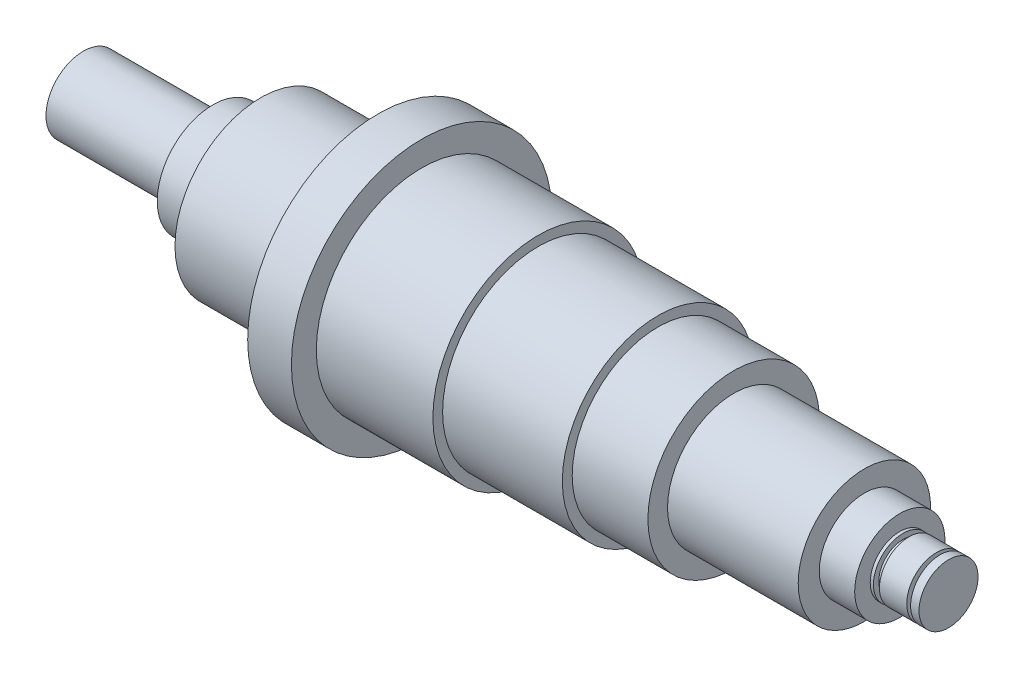
ISO-10303-21;
HEADER;
FILE_DESCRIPTION(('STEP AP214'),'2;1');
FILE_NAME('part.step','',(''),(''),'','','');
FILE_SCHEMA(('AUTOMOTIVE_DESIGN { 1 0 10303 214 1 1 1 1 }'));
ENDSEC;
DATA;
#1=APPLICATION_CONTEXT('core data for automotive mechanical design processes');
#2=APPLICATION_PROTOCOL_DEFINITION('international standard','automotive_design',2000,#1);
#3=PRODUCT_CONTEXT('',#1,'mechanical');
#4=PRODUCT('Part','Part','',(#3));
#5=PRODUCT_RELATED_PRODUCT_CATEGORY('part','',(#4));
#6=PRODUCT_DEFINITION_FORMATION('','',#4);
#7=PRODUCT_DEFINITION_CONTEXT('part definition',#1,'design');
#8=PRODUCT_DEFINITION('design','',#6,#7);
#9=PRODUCT_DEFINITION_SHAPE('','',#8);
#10=(LENGTH_UNIT() NAMED_UNIT(*) SI_UNIT(.MILLI.,.METRE.));
#11=(NAMED_UNIT(*) PLANE_ANGLE_UNIT() SI_UNIT($,.RADIAN.));
#12=(NAMED_UNIT(*) SI_UNIT($,.STERADIAN.) SOLID_ANGLE_UNIT());
#13=UNCERTAINTY_MEASURE_WITH_UNIT(LENGTH_MEASURE(1.E-05),#10,'distance_accuracy_value','');
#14=(GEOMETRIC_REPRESENTATION_CONTEXT(3) GLOBAL_UNCERTAINTY_ASSIGNED_CONTEXT((#13)) GLOBAL_UNIT_ASSIGNED_CONTEXT((#10,
#11,#12)) REPRESENTATION_CONTEXT('',''));
#15=CARTESIAN_POINT('',(0.,0.,0.));
#16=DIRECTION('',(0.,0.,1.));
#17=DIRECTION('',(1.,0.,0.));
#18=AXIS2_PLACEMENT_3D('',#15,#16,#17);
#19=CARTESIAN_POINT('',(-732.666569538298,0.,0.));
#20=DIRECTION('',(-1.,0.,0.));
#21=DIRECTION('',(0.,0.,1.));
#22=AXIS2_PLACEMENT_3D('',#19,#20,#21);
#23=CYLINDRICAL_SURFACE('',#22,31.5923948312581);
#24=CARTESIAN_POINT('',(-732.666569538298,0.,0.));
#25=DIRECTION('',(-1.,0.,0.));
#26=DIRECTION('',(0.,0.,1.));
#27=AXIS2_PLACEMENT_3D('',#24,#25,#26);
#28=CIRCLE('',#27,31.5923948312581);
#29=CARTESIAN_POINT('',(-732.666569538298,0.,31.5923948312581));
#30=VERTEX_POINT('',#29);
#31=EDGE_CURVE('E10',#30,#30,#28,.T.);
#32=ORIENTED_EDGE('',*,*,#31,.F.);
#33=EDGE_LOOP('',(#32));
#34=FACE_BOUND('',#33,.T.);
#35=CARTESIAN_POINT('',(-622.932317141486,0.,0.));
#36=DIRECTION('',(-1.,0.,0.));
#37=DIRECTION('',(0.,0.,1.));
#38=AXIS2_PLACEMENT_3D('',#35,#36,#37);
#39=CIRCLE('',#38,31.5923948312581);
#40=CARTESIAN_POINT('',(-622.932317141486,0.,31.5923948312581));
#41=VERTEX_POINT('',#40);
#42=EDGE_CURVE('E125',#41,#41,#39,.T.);
#43=ORIENTED_EDGE('',*,*,#42,.T.);
#44=EDGE_LOOP('',(#43));
#45=FACE_BOUND('',#44,.T.);
#46=ADVANCED_FACE('F37',(#34,#45),#23,.T.);
#47=CARTESIAN_POINT('',(-732.666569538298,0.,0.));
#48=DIRECTION('',(1.,0.,0.));
#49=DIRECTION('',(0.,0.,-1.));
#50=AXIS2_PLACEMENT_3D('',#47,#48,#49);
#51=PLANE('',#50);
#52=ORIENTED_EDGE('',*,*,#31,.T.);
#53=EDGE_LOOP('',(#52));
#54=FACE_BOUND('',#53,.T.);
#55=ADVANCED_FACE('F287',(#54),#51,.F.);
#56=CARTESIAN_POINT('',(0.,0.,0.));
#57=DIRECTION('',(-1.,0.,0.));
#58=DIRECTION('',(0.,0.,1.));
#59=AXIS2_PLACEMENT_3D('',#56,#57,#58);
#60=PLANE('',#59);
#61=CARTESIAN_POINT('',(0.,0.,0.));
#62=DIRECTION('',(-1.,0.,0.));
#63=DIRECTION('',(0.,0.,1.));
#64=AXIS2_PLACEMENT_3D('',#61,#62,#63);
#65=CIRCLE('',#64,25.);
#66=CARTESIAN_POINT('',(0.,0.,25.));
#67=VERTEX_POINT('',#66);
#68=EDGE_CURVE('E43',#67,#67,#65,.T.);
#69=ORIENTED_EDGE('',*,*,#68,.F.);
#70=EDGE_LOOP('',(#69));
#71=FACE_BOUND('',#70,.T.);
#72=ADVANCED_FACE('F282',(#71),#60,.F.);
#73=CARTESIAN_POINT('',(-732.666569538298,0.,0.));
#74=DIRECTION('',(-1.,0.,0.));
#75=DIRECTION('',(0.,0.,1.));
#76=AXIS2_PLACEMENT_3D('',#73,#74,#75);
#77=CYLINDRICAL_SURFACE('',#76,25.);
#78=CARTESIAN_POINT('',(-7.14828871386097,0.,0.));
#79=DIRECTION('',(-1.,0.,0.));
#80=DIRECTION('',(0.,0.,1.));
#81=AXIS2_PLACEMENT_3D('',#78,#79,#80);
#82=CIRCLE('',#81,25.);
#83=CARTESIAN_POINT('',(-7.14828871386097,0.,25.));
#84=VERTEX_POINT('',#83);
#85=EDGE_CURVE('E47',#84,#84,#82,.T.);
#86=ORIENTED_EDGE('',*,*,#85,.F.);
#87=EDGE_LOOP('',(#86));
#88=FACE_BOUND('',#87,.T.);
#89=ORIENTED_EDGE('',*,*,#68,.T.);
#90=EDGE_LOOP('',(#89));
#91=FACE_BOUND('',#90,.T.);
#92=ADVANCED_FACE('F277',(#88,#91),#77,.T.);
#93=CARTESIAN_POINT('',(-7.14828871386097,0.,0.));
#94=DIRECTION('',(1.,0.,0.));
#95=DIRECTION('',(0.,0.,-1.));
#96=AXIS2_PLACEMENT_3D('',#93,#94,#95);
#97=PLANE('',#96);
#98=CARTESIAN_POINT('',(-7.14828871386097,0.,0.));
#99=DIRECTION('',(-1.,0.,0.));
#100=DIRECTION('',(0.,0.,1.));
#101=AXIS2_PLACEMENT_3D('',#98,#99,#100);
#102=CIRCLE('',#101,20.4717400380726);
#103=CARTESIAN_POINT('',(-7.14828871386097,0.,20.4717400380726));
#104=VERTEX_POINT('',#103);
#105=EDGE_CURVE('E51',#104,#104,#102,.T.);
#106=ORIENTED_EDGE('',*,*,#105,.F.);
#107=EDGE_LOOP('',(#106));
#108=FACE_BOUND('',#107,.T.);
#109=ORIENTED_EDGE('',*,*,#85,.T.);
#110=EDGE_LOOP('',(#109));
#111=FACE_BOUND('',#110,.T.);
#112=ADVANCED_FACE('F271',(#108,#111),#97,.F.);
#113=CARTESIAN_POINT('',(-732.666569538298,0.,0.));
#114=DIRECTION('',(-1.,0.,0.));
#115=DIRECTION('',(0.,0.,1.));
#116=AXIS2_PLACEMENT_3D('',#113,#114,#115);
#117=CYLINDRICAL_SURFACE('',#116,20.4717400380726);
#118=CARTESIAN_POINT('',(-10.3849690302732,0.,0.));
#119=DIRECTION('',(-1.,0.,0.));
#120=DIRECTION('',(0.,0.,1.));
#121=AXIS2_PLACEMENT_3D('',#118,#119,#120);
#122=CIRCLE('',#121,20.4717400380726);
#123=CARTESIAN_POINT('',(-10.3849690302732,0.,20.4717400380726));
#124=VERTEX_POINT('',#123);
#125=EDGE_CURVE('E56',#124,#124,#122,.T.);
#126=ORIENTED_EDGE('',*,*,#125,.F.);
#127=EDGE_LOOP('',(#126));
#128=FACE_BOUND('',#127,.T.);
#129=ORIENTED_EDGE('',*,*,#105,.T.);
#130=EDGE_LOOP('',(#129));
#131=FACE_BOUND('',#130,.T.);
#132=ADVANCED_FACE('F265',(#128,#131),#117,.T.);
#133=CARTESIAN_POINT('',(-10.3849690302732,0.,0.));
#134=DIRECTION('',(-1.,0.,0.));
#135=DIRECTION('',(0.,0.,1.));
#136=AXIS2_PLACEMENT_3D('',#133,#134,#135);
#137=PLANE('',#136);
#138=CARTESIAN_POINT('',(-10.3849690302732,0.,0.));
#139=DIRECTION('',(-1.,0.,0.));
#140=DIRECTION('',(0.,0.,1.));
#141=AXIS2_PLACEMENT_3D('',#138,#139,#140);
#142=CIRCLE('',#141,25.);
#143=CARTESIAN_POINT('',(-10.3849690302732,0.,25.));
#144=VERTEX_POINT('',#143);
#145=EDGE_CURVE('E59',#144,#144,#142,.T.);
#146=ORIENTED_EDGE('',*,*,#145,.F.);
#147=EDGE_LOOP('',(#146));
#148=FACE_BOUND('',#147,.T.);
#149=ORIENTED_EDGE('',*,*,#125,.T.);
#150=EDGE_LOOP('',(#149));
#151=FACE_BOUND('',#150,.T.);
#152=ADVANCED_FACE('F259',(#148,#151),#137,.F.);
#153=CARTESIAN_POINT('',(-732.666569538298,0.,0.));
#154=DIRECTION('',(-1.,0.,0.));
#155=DIRECTION('',(0.,0.,1.));
#156=AXIS2_PLACEMENT_3D('',#153,#154,#155);
#157=CYLINDRICAL_SURFACE('',#156,25.);
#158=CARTESIAN_POINT('',(-33.5041141475036,0.,0.));
#159=DIRECTION('',(-1.,0.,0.));
#160=DIRECTION('',(0.,0.,1.));
#161=AXIS2_PLACEMENT_3D('',#158,#159,#160);
#162=CIRCLE('',#161,25.);
#163=CARTESIAN_POINT('',(-33.5041141475036,0.,25.));
#164=VERTEX_POINT('',#163);
#165=EDGE_CURVE('E62',#164,#164,#162,.T.);
#166=ORIENTED_EDGE('',*,*,#165,.F.);
#167=EDGE_LOOP('',(#166));
#168=FACE_BOUND('',#167,.T.);
#169=ORIENTED_EDGE('',*,*,#145,.T.);
#170=EDGE_LOOP('',(#169));
#171=FACE_BOUND('',#170,.T.);
#172=ADVANCED_FACE('F253',(#168,#171),#157,.T.);
#173=CARTESIAN_POINT('',(-33.5041141475036,0.,0.));
#174=DIRECTION('',(1.,0.,0.));
#175=DIRECTION('',(0.,0.,-1.));
#176=AXIS2_PLACEMENT_3D('',#173,#174,#175);
#177=PLANE('',#176);
#178=CARTESIAN_POINT('',(-33.5041141475036,0.,0.));
#179=DIRECTION('',(-1.,0.,0.));
#180=DIRECTION('',(0.,0.,1.));
#181=AXIS2_PLACEMENT_3D('',#178,#179,#180);
#182=CIRCLE('',#181,20.4717400380726);
#183=CARTESIAN_POINT('',(-33.5041141475036,0.,20.4717400380726));
#184=VERTEX_POINT('',#183);
#185=EDGE_CURVE('E65',#184,#184,#182,.T.);
#186=ORIENTED_EDGE('',*,*,#185,.F.);
#187=EDGE_LOOP('',(#186));
#188=FACE_BOUND('',#187,.T.);
#189=ORIENTED_EDGE('',*,*,#165,.T.);
#190=EDGE_LOOP('',(#189));
#191=FACE_BOUND('',#190,.T.);
#192=ADVANCED_FACE('F247',(#188,#191),#177,.F.);
#193=CARTESIAN_POINT('',(-732.666569538298,0.,0.));
#194=DIRECTION('',(-1.,0.,0.));
#195=DIRECTION('',(0.,0.,1.));
#196=AXIS2_PLACEMENT_3D('',#193,#194,#195);
#197=CYLINDRICAL_SURFACE('',#196,20.4717400380726);
#198=CARTESIAN_POINT('',(-38.5903260732944,0.,0.));
#199=DIRECTION('',(-1.,0.,0.));
#200=DIRECTION('',(0.,0.,1.));
#201=AXIS2_PLACEMENT_3D('',#198,#199,#200);
#202=CIRCLE('',#201,20.4717400380726);
#203=CARTESIAN_POINT('',(-38.5903260732944,0.,20.4717400380726));
#204=VERTEX_POINT('',#203);
#205=EDGE_CURVE('E68',#204,#204,#202,.T.);
#206=ORIENTED_EDGE('',*,*,#205,.F.);
#207=EDGE_LOOP('',(#206));
#208=FACE_BOUND('',#207,.T.);
#209=ORIENTED_EDGE('',*,*,#185,.T.);
#210=EDGE_LOOP('',(#209));
#211=FACE_BOUND('',#210,.T.);
#212=ADVANCED_FACE('F241',(#208,#211),#197,.T.);
#213=CARTESIAN_POINT('',(-38.5903260732944,-4.13938083091105E-13,0.));
#214=DIRECTION('',(-1.,0.,0.));
#215=DIRECTION('',(0.,0.,1.));
#216=AXIS2_PLACEMENT_3D('',#213,#214,#215);
#217=PLANE('',#216);
#218=CARTESIAN_POINT('',(-38.5903260732944,0.,0.));
#219=DIRECTION('',(-1.,0.,0.));
#220=DIRECTION('',(0.,0.,1.));
#221=AXIS2_PLACEMENT_3D('',#218,#219,#220);
#222=CIRCLE('',#221,25.);
#223=CARTESIAN_POINT('',(-38.5903260732944,0.,25.));
#224=VERTEX_POINT('',#223);
#225=EDGE_CURVE('E71',#224,#224,#222,.T.);
#226=ORIENTED_EDGE('',*,*,#225,.F.);
#227=EDGE_LOOP('',(#226));
#228=FACE_BOUND('',#227,.T.);
#229=ORIENTED_EDGE('',*,*,#205,.T.);
#230=EDGE_LOOP('',(#229));
#231=FACE_BOUND('',#230,.T.);
#232=ADVANCED_FACE('F235',(#228,#231),#217,.F.);
#233=CARTESIAN_POINT('',(-732.666569538298,0.,0.));
#234=DIRECTION('',(-1.,0.,0.));
#235=DIRECTION('',(0.,0.,1.));
#236=AXIS2_PLACEMENT_3D('',#233,#234,#235);
#237=CYLINDRICAL_SURFACE('',#236,25.);
#238=CARTESIAN_POINT('',(-41.3110403099847,0.,0.));
#239=DIRECTION('',(-1.,0.,0.));
#240=DIRECTION('',(0.,0.,1.));
#241=AXIS2_PLACEMENT_3D('',#238,#239,#240);
#242=CIRCLE('',#241,25.);
#243=CARTESIAN_POINT('',(-41.3110403099847,0.,25.));
#244=VERTEX_POINT('',#243);
#245=EDGE_CURVE('E74',#244,#244,#242,.T.);
#246=ORIENTED_EDGE('',*,*,#245,.F.);
#247=EDGE_LOOP('',(#246));
#248=FACE_BOUND('',#247,.T.);
#249=ORIENTED_EDGE('',*,*,#225,.T.);
#250=EDGE_LOOP('',(#249));
#251=FACE_BOUND('',#250,.T.);
#252=ADVANCED_FACE('F229',(#248,#251),#237,.T.);
#253=CARTESIAN_POINT('',(-41.3110403099847,0.,0.));
#254=DIRECTION('',(-1.,0.,0.));
#255=DIRECTION('',(0.,0.,1.));
#256=AXIS2_PLACEMENT_3D('',#253,#254,#255);
#257=PLANE('',#256);
#258=CARTESIAN_POINT('',(-41.3110403099847,0.,0.));
#259=DIRECTION('',(-1.,0.,0.));
#260=DIRECTION('',(0.,0.,1.));
#261=AXIS2_PLACEMENT_3D('',#258,#259,#260);
#262=CIRCLE('',#261,38.1847896625163);
#263=CARTESIAN_POINT('',(-41.3110403099847,0.,38.1847896625163));
#264=VERTEX_POINT('',#263);
#265=EDGE_CURVE('E77',#264,#264,#262,.T.);
#266=ORIENTED_EDGE('',*,*,#265,.F.);
#267=EDGE_LOOP('',(#266));
#268=FACE_BOUND('',#267,.T.);
#269=ORIENTED_EDGE('',*,*,#245,.T.);
#270=EDGE_LOOP('',(#269));
#271=FACE_BOUND('',#270,.T.);
#272=ADVANCED_FACE('F223',(#268,#271),#257,.F.);
#273=CARTESIAN_POINT('',(-732.666569538298,0.,0.));
#274=DIRECTION('',(-1.,0.,0.));
#275=DIRECTION('',(0.,0.,1.));
#276=AXIS2_PLACEMENT_3D('',#273,#274,#275);
#277=CYLINDRICAL_SURFACE('',#276,38.1847896625163);
#278=CARTESIAN_POINT('',(-71.2650353921759,0.,0.));
#279=DIRECTION('',(-1.,0.,0.));
#280=DIRECTION('',(0.,0.,1.));
#281=AXIS2_PLACEMENT_3D('',#278,#279,#280);
#282=CIRCLE('',#281,38.1847896625163);
#283=CARTESIAN_POINT('',(-71.2650353921759,0.,38.1847896625163));
#284=VERTEX_POINT('',#283);
#285=EDGE_CURVE('E80',#284,#284,#282,.T.);
#286=ORIENTED_EDGE('',*,*,#285,.F.);
#287=EDGE_LOOP('',(#286));
#288=FACE_BOUND('',#287,.T.);
#289=ORIENTED_EDGE('',*,*,#265,.T.);
#290=EDGE_LOOP('',(#289));
#291=FACE_BOUND('',#290,.T.);
#292=ADVANCED_FACE('F217',(#288,#291),#277,.T.);
#293=CARTESIAN_POINT('',(-71.2650353921759,0.,0.));
#294=DIRECTION('',(-1.,0.,0.));
#295=DIRECTION('',(0.,0.,1.));
#296=AXIS2_PLACEMENT_3D('',#293,#294,#295);
#297=PLANE('',#296);
#298=CARTESIAN_POINT('',(-71.2650353921759,0.,0.));
#299=DIRECTION('',(-1.,0.,0.));
#300=DIRECTION('',(0.,0.,1.));
#301=AXIS2_PLACEMENT_3D('',#298,#299,#300);
#302=CIRCLE('',#301,56.0242356320245);
#303=CARTESIAN_POINT('',(-71.2650353921759,0.,56.0242356320245));
#304=VERTEX_POINT('',#303);
#305=EDGE_CURVE('E83',#304,#304,#302,.T.);
#306=ORIENTED_EDGE('',*,*,#305,.F.);
#307=EDGE_LOOP('',(#306));
#308=FACE_BOUND('',#307,.T.);
#309=ORIENTED_EDGE('',*,*,#285,.T.);
#310=EDGE_LOOP('',(#309));
#311=FACE_BOUND('',#310,.T.);
#312=ADVANCED_FACE('F211',(#308,#311),#297,.F.);
#313=CARTESIAN_POINT('',(-732.666569538298,0.,0.));
#314=DIRECTION('',(-1.,0.,0.));
#315=DIRECTION('',(0.,0.,1.));
#316=AXIS2_PLACEMENT_3D('',#313,#314,#315);
#317=CYLINDRICAL_SURFACE('',#316,56.0242356320245);
#318=CARTESIAN_POINT('',(-181.930073101329,0.,0.));
#319=DIRECTION('',(-1.,0.,0.));
#320=DIRECTION('',(0.,0.,1.));
#321=AXIS2_PLACEMENT_3D('',#318,#319,#320);
#322=CIRCLE('',#321,56.0242356320245);
#323=CARTESIAN_POINT('',(-181.930073101329,0.,56.0242356320245));
#324=VERTEX_POINT('',#323);
#325=EDGE_CURVE('E86',#324,#324,#322,.T.);
#326=ORIENTED_EDGE('',*,*,#325,.F.);
#327=EDGE_LOOP('',(#326));
#328=FACE_BOUND('',#327,.T.);
#329=ORIENTED_EDGE('',*,*,#305,.T.);
#330=EDGE_LOOP('',(#329));
#331=FACE_BOUND('',#330,.T.);
#332=ADVANCED_FACE('F205',(#328,#331),#317,.T.);
#333=CARTESIAN_POINT('',(-181.930073101329,0.,0.));
#334=DIRECTION('',(-1.,0.,0.));
#335=DIRECTION('',(0.,0.,1.));
#336=AXIS2_PLACEMENT_3D('',#333,#334,#335);
#337=PLANE('',#336);
#338=CARTESIAN_POINT('',(-181.930073101329,0.,0.));
#339=DIRECTION('',(-1.,0.,0.));
#340=DIRECTION('',(0.,0.,1.));
#341=AXIS2_PLACEMENT_3D('',#338,#339,#340);
#342=CIRCLE('',#341,72.6542276374983);
#343=CARTESIAN_POINT('',(-181.930073101329,0.,72.6542276374983));
#344=VERTEX_POINT('',#343);
#345=EDGE_CURVE('E89',#344,#344,#342,.T.);
#346=ORIENTED_EDGE('',*,*,#345,.F.);
#347=EDGE_LOOP('',(#346));
#348=FACE_BOUND('',#347,.T.);
#349=ORIENTED_EDGE('',*,*,#325,.T.);
#350=EDGE_LOOP('',(#349));
#351=FACE_BOUND('',#350,.T.);
#352=ADVANCED_FACE('F199',(#348,#351),#337,.F.);
#353=CARTESIAN_POINT('',(-732.666569538298,0.,0.));
#354=DIRECTION('',(-1.,0.,0.));
#355=DIRECTION('',(0.,0.,1.));
#356=AXIS2_PLACEMENT_3D('',#353,#354,#355);
#357=CYLINDRICAL_SURFACE('',#356,72.6542276374983);
#358=CARTESIAN_POINT('',(-246.031133195155,0.,0.));
#359=DIRECTION('',(-1.,0.,0.));
#360=DIRECTION('',(0.,0.,1.));
#361=AXIS2_PLACEMENT_3D('',#358,#359,#360);
#362=CIRCLE('',#361,72.6542276374983);
#363=CARTESIAN_POINT('',(-246.031133195155,0.,72.6542276374983));
#364=VERTEX_POINT('',#363);
#365=EDGE_CURVE('E92',#364,#364,#362,.T.);
#366=ORIENTED_EDGE('',*,*,#365,.F.);
#367=EDGE_LOOP('',(#366));
#368=FACE_BOUND('',#367,.T.);
#369=ORIENTED_EDGE('',*,*,#345,.T.);
#370=EDGE_LOOP('',(#369));
#371=FACE_BOUND('',#370,.T.);
#372=ADVANCED_FACE('F193',(#368,#371),#357,.T.);
#373=CARTESIAN_POINT('',(-246.031133195155,0.,0.));
#374=DIRECTION('',(-1.,0.,0.));
#375=DIRECTION('',(0.,0.,1.));
#376=AXIS2_PLACEMENT_3D('',#373,#374,#375);
#377=PLANE('',#376);
#378=CARTESIAN_POINT('',(-246.031133195155,0.,0.));
#379=DIRECTION('',(-1.,0.,0.));
#380=DIRECTION('',(0.,0.,1.));
#381=AXIS2_PLACEMENT_3D('',#378,#379,#380);
#382=CIRCLE('',#381,81.0107310972691);
#383=CARTESIAN_POINT('',(-246.031133195155,0.,81.0107310972691));
#384=VERTEX_POINT('',#383);
#385=EDGE_CURVE('E95',#384,#384,#382,.T.);
#386=ORIENTED_EDGE('',*,*,#385,.F.);
#387=EDGE_LOOP('',(#386));
#388=FACE_BOUND('',#387,.T.);
#389=ORIENTED_EDGE('',*,*,#365,.T.);
#390=EDGE_LOOP('',(#389));
#391=FACE_BOUND('',#390,.T.);
#392=ADVANCED_FACE('F187',(#388,#391),#377,.F.);
#393=CARTESIAN_POINT('',(-732.666569538298,0.,0.));
#394=DIRECTION('',(-1.,0.,0.));
#395=DIRECTION('',(0.,0.,1.));
#396=AXIS2_PLACEMENT_3D('',#393,#394,#395);
#397=CYLINDRICAL_SURFACE('',#396,81.0107310972691);
#398=CARTESIAN_POINT('',(-347.417415209531,0.,0.));
#399=DIRECTION('',(-1.,0.,0.));
#400=DIRECTION('',(0.,0.,1.));
#401=AXIS2_PLACEMENT_3D('',#398,#399,#400);
#402=CIRCLE('',#401,81.0107310972691);
#403=CARTESIAN_POINT('',(-347.417415209531,0.,81.0107310972691));
#404=VERTEX_POINT('',#403);
#405=EDGE_CURVE('E98',#404,#404,#402,.T.);
#406=ORIENTED_EDGE('',*,*,#405,.F.);
#407=EDGE_LOOP('',(#406));
#408=FACE_BOUND('',#407,.T.);
#409=ORIENTED_EDGE('',*,*,#385,.T.);
#410=EDGE_LOOP('',(#409));
#411=FACE_BOUND('',#410,.T.);
#412=ADVANCED_FACE('F181',(#408,#411),#397,.T.);
#413=CARTESIAN_POINT('',(-347.417415209531,0.,0.));
#414=DIRECTION('',(-1.,0.,0.));
#415=DIRECTION('',(0.,0.,1.));
#416=AXIS2_PLACEMENT_3D('',#413,#414,#415);
#417=PLANE('',#416);
#418=CARTESIAN_POINT('',(-347.417415209531,0.,0.));
#419=DIRECTION('',(-1.,0.,0.));
#420=DIRECTION('',(0.,0.,1.));
#421=AXIS2_PLACEMENT_3D('',#418,#419,#420);
#422=CIRCLE('',#421,89.2375213615267);
#423=CARTESIAN_POINT('',(-347.417415209531,0.,89.2375213615267));
#424=VERTEX_POINT('',#423);
#425=EDGE_CURVE('E101',#424,#424,#422,.T.);
#426=ORIENTED_EDGE('',*,*,#425,.F.);
#427=EDGE_LOOP('',(#426));
#428=FACE_BOUND('',#427,.T.);
#429=ORIENTED_EDGE('',*,*,#405,.T.);
#430=EDGE_LOOP('',(#429));
#431=FACE_BOUND('',#430,.T.);
#432=ADVANCED_FACE('F175',(#428,#431),#417,.F.);
#433=CARTESIAN_POINT('',(-732.666569538298,0.,0.));
#434=DIRECTION('',(-1.,0.,0.));
#435=DIRECTION('',(0.,0.,1.));
#436=AXIS2_PLACEMENT_3D('',#433,#434,#435);
#437=CYLINDRICAL_SURFACE('',#436,89.2375213615267);
#438=CARTESIAN_POINT('',(-446.138898380622,0.,0.));
#439=DIRECTION('',(-1.,0.,0.));
#440=DIRECTION('',(0.,0.,1.));
#441=AXIS2_PLACEMENT_3D('',#438,#439,#440);
#442=CIRCLE('',#441,89.2375213615267);
#443=CARTESIAN_POINT('',(-446.138898380622,0.,89.2375213615267));
#444=VERTEX_POINT('',#443);
#445=EDGE_CURVE('E104',#444,#444,#442,.T.);
#446=ORIENTED_EDGE('',*,*,#445,.F.);
#447=EDGE_LOOP('',(#446));
#448=FACE_BOUND('',#447,.T.);
#449=ORIENTED_EDGE('',*,*,#425,.T.);
#450=EDGE_LOOP('',(#449));
#451=FACE_BOUND('',#450,.T.);
#452=ADVANCED_FACE('F169',(#448,#451),#437,.T.);
#453=CARTESIAN_POINT('',(-446.138898380622,0.,0.));
#454=DIRECTION('',(-1.,0.,0.));
#455=DIRECTION('',(0.,0.,1.));
#456=AXIS2_PLACEMENT_3D('',#453,#454,#455);
#457=PLANE('',#456);
#458=CARTESIAN_POINT('',(-446.138898380622,0.,0.));
#459=DIRECTION('',(-1.,0.,0.));
#460=DIRECTION('',(0.,0.,1.));
#461=AXIS2_PLACEMENT_3D('',#458,#459,#460);
#462=CIRCLE('',#461,110.318671413687);
#463=CARTESIAN_POINT('',(-446.138898380622,0.,110.318671413687));
#464=VERTEX_POINT('',#463);
#465=EDGE_CURVE('E107',#464,#464,#462,.T.);
#466=ORIENTED_EDGE('',*,*,#465,.F.);
#467=EDGE_LOOP('',(#466));
#468=FACE_BOUND('',#467,.T.);
#469=ORIENTED_EDGE('',*,*,#445,.T.);
#470=EDGE_LOOP('',(#469));
#471=FACE_BOUND('',#470,.T.);
#472=ADVANCED_FACE('F163',(#468,#471),#457,.F.);
#473=CARTESIAN_POINT('',(-732.666569538298,0.,0.));
#474=DIRECTION('',(-1.,0.,0.));
#475=DIRECTION('',(0.,0.,1.));
#476=AXIS2_PLACEMENT_3D('',#473,#474,#475);
#477=CYLINDRICAL_SURFACE('',#476,110.318671413687);
#478=CARTESIAN_POINT('',(-483.159454569781,0.,0.));
#479=DIRECTION('',(-1.,0.,0.));
#480=DIRECTION('',(0.,0.,1.));
#481=AXIS2_PLACEMENT_3D('',#478,#479,#480);
#482=CIRCLE('',#481,110.318671413687);
#483=CARTESIAN_POINT('',(-483.159454569781,0.,110.318671413687));
#484=VERTEX_POINT('',#483);
#485=EDGE_CURVE('E110',#484,#484,#482,.T.);
#486=ORIENTED_EDGE('',*,*,#485,.F.);
#487=EDGE_LOOP('',(#486));
#488=FACE_BOUND('',#487,.T.);
#489=ORIENTED_EDGE('',*,*,#465,.T.);
#490=EDGE_LOOP('',(#489));
#491=FACE_BOUND('',#490,.T.);
#492=ADVANCED_FACE('F157',(#488,#491),#477,.T.);
#493=CARTESIAN_POINT('',(-483.159454569781,0.,0.));
#494=DIRECTION('',(1.,0.,0.));
#495=DIRECTION('',(0.,0.,-1.));
#496=AXIS2_PLACEMENT_3D('',#493,#494,#495);
#497=PLANE('',#496);
#498=CARTESIAN_POINT('',(-483.159454569781,0.,0.));
#499=DIRECTION('',(-1.,0.,0.));
#500=DIRECTION('',(0.,0.,1.));
#501=AXIS2_PLACEMENT_3D('',#498,#499,#500);
#502=CIRCLE('',#501,72.6542276374983);
#503=CARTESIAN_POINT('',(-483.159454569781,0.,72.6542276374983));
#504=VERTEX_POINT('',#503);
#505=EDGE_CURVE('E113',#504,#504,#502,.T.);
#506=ORIENTED_EDGE('',*,*,#505,.F.);
#507=EDGE_LOOP('',(#506));
#508=FACE_BOUND('',#507,.T.);
#509=ORIENTED_EDGE('',*,*,#485,.T.);
#510=EDGE_LOOP('',(#509));
#511=FACE_BOUND('',#510,.T.);
#512=ADVANCED_FACE('F151',(#508,#511),#497,.F.);
#513=CARTESIAN_POINT('',(-732.666569538298,0.,0.));
#514=DIRECTION('',(-1.,0.,0.));
#515=DIRECTION('',(0.,0.,1.));
#516=AXIS2_PLACEMENT_3D('',#513,#514,#515);
#517=CYLINDRICAL_SURFACE('',#516,72.6542276374983);
#518=CARTESIAN_POINT('',(-582.395112132388,0.,0.));
#519=DIRECTION('',(-1.,0.,0.));
#520=DIRECTION('',(0.,0.,1.));
#521=AXIS2_PLACEMENT_3D('',#518,#519,#520);
#522=CIRCLE('',#521,72.6542276374983);
#523=CARTESIAN_POINT('',(-582.395112132388,0.,72.6542276374983));
#524=VERTEX_POINT('',#523);
#525=EDGE_CURVE('E116',#524,#524,#522,.T.);
#526=ORIENTED_EDGE('',*,*,#525,.F.);
#527=EDGE_LOOP('',(#526));
#528=FACE_BOUND('',#527,.T.);
#529=ORIENTED_EDGE('',*,*,#505,.T.);
#530=EDGE_LOOP('',(#529));
#531=FACE_BOUND('',#530,.T.);
#532=ADVANCED_FACE('F145',(#528,#531),#517,.T.);
#533=CARTESIAN_POINT('',(-582.395112132388,0.,0.));
#534=DIRECTION('',(1.,0.,0.));
#535=DIRECTION('',(0.,0.,-1.));
#536=AXIS2_PLACEMENT_3D('',#533,#534,#535);
#537=PLANE('',#536);
#538=CARTESIAN_POINT('',(-582.395112132388,0.,0.));
#539=DIRECTION('',(-1.,0.,0.));
#540=DIRECTION('',(0.,0.,1.));
#541=AXIS2_PLACEMENT_3D('',#538,#539,#540);
#542=CIRCLE('',#541,47.1045126472704);
#543=CARTESIAN_POINT('',(-582.395112132388,0.,47.1045126472704));
#544=VERTEX_POINT('',#543);
#545=EDGE_CURVE('E119',#544,#544,#542,.T.);
#546=ORIENTED_EDGE('',*,*,#545,.F.);
#547=EDGE_LOOP('',(#546));
#548=FACE_BOUND('',#547,.T.);
#549=ORIENTED_EDGE('',*,*,#525,.T.);
#550=EDGE_LOOP('',(#549));
#551=FACE_BOUND('',#550,.T.);
#552=ADVANCED_FACE('F139',(#548,#551),#537,.F.);
#553=CARTESIAN_POINT('',(-732.666569538298,0.,0.));
#554=DIRECTION('',(-1.,0.,0.));
#555=DIRECTION('',(0.,0.,1.));
#556=AXIS2_PLACEMENT_3D('',#553,#554,#555);
#557=CYLINDRICAL_SURFACE('',#556,47.1045126472704);
#558=CARTESIAN_POINT('',(-622.932317141486,0.,0.));
#559=DIRECTION('',(-1.,0.,0.));
#560=DIRECTION('',(0.,0.,1.));
#561=AXIS2_PLACEMENT_3D('',#558,#559,#560);
#562=CIRCLE('',#561,47.1045126472704);
#563=CARTESIAN_POINT('',(-622.932317141486,0.,47.1045126472704));
#564=VERTEX_POINT('',#563);
#565=EDGE_CURVE('E122',#564,#564,#562,.T.);
#566=ORIENTED_EDGE('',*,*,#565,.F.);
#567=EDGE_LOOP('',(#566));
#568=FACE_BOUND('',#567,.T.);
#569=ORIENTED_EDGE('',*,*,#545,.T.);
#570=EDGE_LOOP('',(#569));
#571=FACE_BOUND('',#570,.T.);
#572=ADVANCED_FACE('F133',(#568,#571),#557,.T.);
#573=CARTESIAN_POINT('',(-622.932317141486,0.,0.));
#574=DIRECTION('',(1.,0.,0.));
#575=DIRECTION('',(0.,0.,-1.));
#576=AXIS2_PLACEMENT_3D('',#573,#574,#575);
#577=PLANE('',#576);
#578=ORIENTED_EDGE('',*,*,#42,.F.);
#579=EDGE_LOOP('',(#578));
#580=FACE_BOUND('',#579,.T.);
#581=ORIENTED_EDGE('',*,*,#565,.T.);
#582=EDGE_LOOP('',(#581));
#583=FACE_BOUND('',#582,.T.);
#584=ADVANCED_FACE('F130',(#580,#583),#577,.F.);
#585=CLOSED_SHELL('',(#46,#55,#72,#92,#112,#132,#152,#172,#192,#212,#232,#252,#272,#292,#312,
#332,#352,#372,#392,#412,#432,#452,#472,#492,#512,#532,#552,#572,#584));
#586=MANIFOLD_SOLID_BREP('B2',#585);
#587=ADVANCED_BREP_SHAPE_REPRESENTATION('',(#18,#586),#14);
#588=SHAPE_DEFINITION_REPRESENTATION(#9,#587);
ENDSEC;
END-ISO-10303-21;
